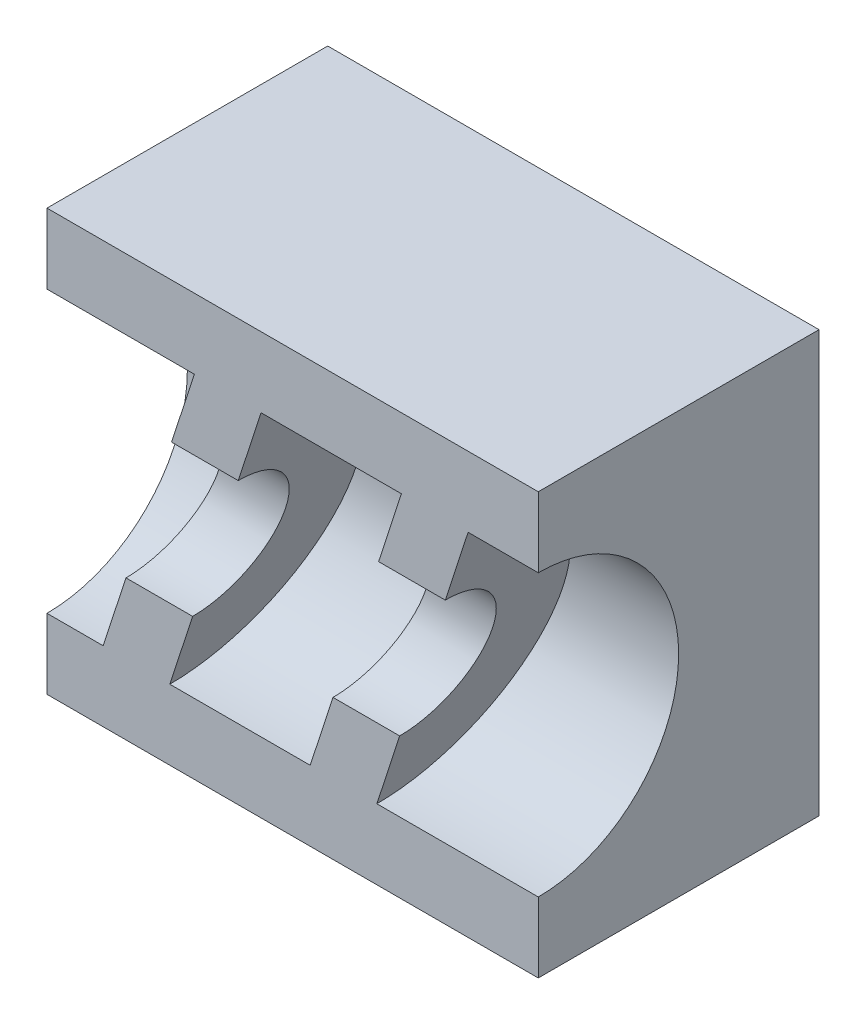
ISO-10303-21;
HEADER;
FILE_DESCRIPTION(('STEP AP214'),'2;1');
FILE_NAME('part.step','',(''),(''),'','','');
FILE_SCHEMA(('AUTOMOTIVE_DESIGN { 1 0 10303 214 1 1 1 1 }'));
ENDSEC;
DATA;
#1=APPLICATION_CONTEXT('core data for automotive mechanical design processes');
#2=APPLICATION_PROTOCOL_DEFINITION('international standard','automotive_design',2000,#1);
#3=PRODUCT_CONTEXT('',#1,'mechanical');
#4=PRODUCT('Part','Part','',(#3));
#5=PRODUCT_RELATED_PRODUCT_CATEGORY('part','',(#4));
#6=PRODUCT_DEFINITION_FORMATION('','',#4);
#7=PRODUCT_DEFINITION_CONTEXT('part definition',#1,'design');
#8=PRODUCT_DEFINITION('design','',#6,#7);
#9=PRODUCT_DEFINITION_SHAPE('','',#8);
#10=(LENGTH_UNIT() NAMED_UNIT(*) SI_UNIT(.MILLI.,.METRE.));
#11=(NAMED_UNIT(*) PLANE_ANGLE_UNIT() SI_UNIT($,.RADIAN.));
#12=(NAMED_UNIT(*) SI_UNIT($,.STERADIAN.) SOLID_ANGLE_UNIT());
#13=UNCERTAINTY_MEASURE_WITH_UNIT(LENGTH_MEASURE(1.E-05),#10,'distance_accuracy_value','');
#14=(GEOMETRIC_REPRESENTATION_CONTEXT(3) GLOBAL_UNCERTAINTY_ASSIGNED_CONTEXT((#13)) GLOBAL_UNIT_ASSIGNED_CONTEXT((#10,
#11,#12)) REPRESENTATION_CONTEXT('',''));
#15=CARTESIAN_POINT('',(0.,0.,0.));
#16=DIRECTION('',(0.,0.,1.));
#17=DIRECTION('',(1.,0.,0.));
#18=AXIS2_PLACEMENT_3D('',#15,#16,#17);
#19=CARTESIAN_POINT('',(0.,0.,4.));
#20=DIRECTION('',(0.,0.,-1.));
#21=DIRECTION('',(-1.,0.,0.));
#22=AXIS2_PLACEMENT_3D('',#19,#20,#21);
#23=PLANE('',#22);
#24=DIRECTION('',(-0.309016994374951,-0.951056516295152,0.));
#25=VECTOR('',#24,1.);
#26=CARTESIAN_POINT('',(2.1,5.,4.));
#27=LINE('',#26,#25);
#28=CARTESIAN_POINT('',(2.1,5.,4.));
#29=VERTEX_POINT('',#28);
#30=CARTESIAN_POINT('',(1.77508030376709,4.,4.));
#31=VERTEX_POINT('',#30);
#32=EDGE_CURVE('E145',#29,#31,#27,.T.);
#33=ORIENTED_EDGE('',*,*,#32,.T.);
#34=DIRECTION('',(1.,0.,0.));
#35=VECTOR('',#34,1.);
#36=CARTESIAN_POINT('',(0.,4.,4.));
#37=LINE('',#36,#35);
#38=CARTESIAN_POINT('',(2.72508030376709,4.,4.));
#39=VERTEX_POINT('',#38);
#40=EDGE_CURVE('E135',#31,#39,#37,.T.);
#41=ORIENTED_EDGE('',*,*,#40,.T.);
#42=DIRECTION('',(0.309016994374951,0.951056516295152,0.));
#43=VECTOR('',#42,1.);
#44=CARTESIAN_POINT('',(3.05,5.,4.));
#45=LINE('',#44,#43);
#46=CARTESIAN_POINT('',(3.05,5.,4.));
#47=VERTEX_POINT('',#46);
#48=EDGE_CURVE('E142',#39,#47,#45,.T.);
#49=ORIENTED_EDGE('',*,*,#48,.T.);
#50=DIRECTION('',(-1.,0.,0.));
#51=VECTOR('',#50,1.);
#52=CARTESIAN_POINT('',(7.,5.,4.));
#53=LINE('',#52,#51);
#54=CARTESIAN_POINT('',(5.05,5.,4.));
#55=VERTEX_POINT('',#54);
#56=EDGE_CURVE('E214',#47,#55,#53,.F.);
#57=ORIENTED_EDGE('',*,*,#56,.T.);
#58=DIRECTION('',(-0.309016994374951,-0.951056516295152,0.));
#59=VECTOR('',#58,1.);
#60=CARTESIAN_POINT('',(5.05,5.,4.));
#61=LINE('',#60,#59);
#62=CARTESIAN_POINT('',(4.72508030376709,4.,4.));
#63=VERTEX_POINT('',#62);
#64=EDGE_CURVE('E164',#55,#63,#61,.T.);
#65=ORIENTED_EDGE('',*,*,#64,.T.);
#66=CARTESIAN_POINT('',(5.67508030376709,4.,4.));
#67=VERTEX_POINT('',#66);
#68=EDGE_CURVE('E148',#63,#67,#37,.T.);
#69=ORIENTED_EDGE('',*,*,#68,.T.);
#70=DIRECTION('',(0.309016994374951,0.951056516295152,0.));
#71=VECTOR('',#70,1.);
#72=CARTESIAN_POINT('',(6.,5.,4.));
#73=LINE('',#72,#71);
#74=CARTESIAN_POINT('',(6.,5.,4.));
#75=VERTEX_POINT('',#74);
#76=EDGE_CURVE('E167',#67,#75,#73,.T.);
#77=ORIENTED_EDGE('',*,*,#76,.T.);
#78=CARTESIAN_POINT('',(7.,5.,4.));
#79=VERTEX_POINT('',#78);
#80=EDGE_CURVE('E210',#75,#79,#53,.F.);
#81=ORIENTED_EDGE('',*,*,#80,.T.);
#82=DIRECTION('',(0.,1.,0.));
#83=VECTOR('',#82,1.);
#84=CARTESIAN_POINT('',(7.,0.,4.));
#85=LINE('',#84,#83);
#86=CARTESIAN_POINT('',(7.,6.,4.));
#87=VERTEX_POINT('',#86);
#88=EDGE_CURVE('E184',#79,#87,#85,.T.);
#89=ORIENTED_EDGE('',*,*,#88,.T.);
#90=DIRECTION('',(-1.,0.,0.));
#91=VECTOR('',#90,1.);
#92=CARTESIAN_POINT('',(0.,6.,4.));
#93=LINE('',#92,#91);
#94=CARTESIAN_POINT('',(0.,6.,4.));
#95=VERTEX_POINT('',#94);
#96=EDGE_CURVE('E188',#87,#95,#93,.T.);
#97=ORIENTED_EDGE('',*,*,#96,.T.);
#98=DIRECTION('',(0.,-1.,0.));
#99=VECTOR('',#98,1.);
#100=CARTESIAN_POINT('',(0.,0.,4.));
#101=LINE('',#100,#99);
#102=CARTESIAN_POINT('',(0.,5.,4.));
#103=VERTEX_POINT('',#102);
#104=EDGE_CURVE('E178',#95,#103,#101,.T.);
#105=ORIENTED_EDGE('',*,*,#104,.T.);
#106=EDGE_CURVE('E211',#103,#29,#53,.F.);
#107=ORIENTED_EDGE('',*,*,#106,.T.);
#108=EDGE_LOOP('',(#33,#41,#49,#57,#65,#69,#77,#81,#89,#97,#105,#107));
#109=FACE_BOUND('',#108,.T.);
#110=ADVANCED_FACE('F36',(#109),#23,.F.);
#111=CARTESIAN_POINT('',(7.,3.,4.));
#112=DIRECTION('',(-1.,0.,0.));
#113=DIRECTION('',(0.,0.,1.));
#114=AXIS2_PLACEMENT_3D('',#111,#112,#113);
#115=CYLINDRICAL_SURFACE('',#114,2.);
#116=DIRECTION('',(-1.,0.,0.));
#117=VECTOR('',#116,1.);
#118=CARTESIAN_POINT('',(7.,1.,4.));
#119=LINE('',#118,#117);
#120=CARTESIAN_POINT('',(0.800321215068356,1.,4.));
#121=VERTEX_POINT('',#120);
#122=CARTESIAN_POINT('',(0.,1.,4.));
#123=VERTEX_POINT('',#122);
#124=EDGE_CURVE('E213',#121,#123,#119,.T.);
#125=ORIENTED_EDGE('',*,*,#124,.F.);
#126=CARTESIAN_POINT('',(1.45016060753418,3.,4.));
#127=DIRECTION('',(-0.951056516295152,0.309016994374951,0.));
#128=DIRECTION('',(-0.309016994374951,-0.951056516295152,0.));
#129=AXIS2_PLACEMENT_3D('',#126,#127,#128);
#130=ELLIPSE('',#129,2.10292444847654,2.);
#131=EDGE_CURVE('E160',#121,#29,#130,.F.);
#132=ORIENTED_EDGE('',*,*,#131,.T.);
#133=ORIENTED_EDGE('',*,*,#106,.F.);
#134=CARTESIAN_POINT('',(0.,3.,4.));
#135=DIRECTION('',(-1.,0.,0.));
#136=DIRECTION('',(0.,0.,1.));
#137=AXIS2_PLACEMENT_3D('',#134,#135,#136);
#138=CIRCLE('',#137,2.);
#139=EDGE_CURVE('E171',#103,#123,#138,.T.);
#140=ORIENTED_EDGE('',*,*,#139,.T.);
#141=EDGE_LOOP('',(#125,#132,#133,#140));
#142=FACE_BOUND('',#141,.T.);
#143=ADVANCED_FACE('F259',(#142),#115,.F.);
#144=ORIENTED_EDGE('',*,*,#56,.F.);
#145=CARTESIAN_POINT('',(2.40016060753418,3.,4.));
#146=DIRECTION('',(0.951056516295152,-0.309016994374951,0.));
#147=DIRECTION('',(-0.309016994374951,-0.951056516295152,0.));
#148=AXIS2_PLACEMENT_3D('',#145,#146,#147);
#149=ELLIPSE('',#148,2.10292444847654,2.);
#150=CARTESIAN_POINT('',(1.75032121506836,1.,4.));
#151=VERTEX_POINT('',#150);
#152=EDGE_CURVE('E151',#47,#151,#149,.F.);
#153=ORIENTED_EDGE('',*,*,#152,.T.);
#154=CARTESIAN_POINT('',(3.75032121506836,1.,4.));
#155=VERTEX_POINT('',#154);
#156=EDGE_CURVE('E219',#155,#151,#119,.T.);
#157=ORIENTED_EDGE('',*,*,#156,.F.);
#158=CARTESIAN_POINT('',(4.40016060753418,3.,4.));
#159=DIRECTION('',(-0.951056516295153,0.309016994374951,0.));
#160=DIRECTION('',(-0.309016994374951,-0.951056516295152,0.));
#161=AXIS2_PLACEMENT_3D('',#158,#159,#160);
#162=ELLIPSE('',#161,2.10292444847654,2.);
#163=EDGE_CURVE('E44',#155,#55,#162,.F.);
#164=ORIENTED_EDGE('',*,*,#163,.T.);
#165=EDGE_LOOP('',(#144,#153,#157,#164));
#166=FACE_BOUND('',#165,.T.);
#167=ADVANCED_FACE('F225',(#166),#115,.F.);
#168=CARTESIAN_POINT('',(0.,0.,4.));
#169=DIRECTION('',(1.,0.,0.));
#170=DIRECTION('',(0.,0.,-1.));
#171=AXIS2_PLACEMENT_3D('',#168,#169,#170);
#172=PLANE('',#171);
#173=CARTESIAN_POINT('',(0.,0.,4.));
#174=VERTEX_POINT('',#173);
#175=EDGE_CURVE('E182',#123,#174,#101,.T.);
#176=ORIENTED_EDGE('',*,*,#175,.F.);
#177=ORIENTED_EDGE('',*,*,#139,.F.);
#178=ORIENTED_EDGE('',*,*,#104,.F.);
#179=DIRECTION('',(0.,0.,-1.));
#180=VECTOR('',#179,1.);
#181=CARTESIAN_POINT('',(0.,6.,4.));
#182=LINE('',#181,#180);
#183=CARTESIAN_POINT('',(0.,6.,0.));
#184=VERTEX_POINT('',#183);
#185=EDGE_CURVE('E190',#95,#184,#182,.T.);
#186=ORIENTED_EDGE('',*,*,#185,.T.);
#187=DIRECTION('',(0.,-1.,0.));
#188=VECTOR('',#187,1.);
#189=CARTESIAN_POINT('',(0.,0.,0.));
#190=LINE('',#189,#188);
#191=CARTESIAN_POINT('',(0.,0.,0.));
#192=VERTEX_POINT('',#191);
#193=EDGE_CURVE('E175',#184,#192,#190,.T.);
#194=ORIENTED_EDGE('',*,*,#193,.T.);
#195=DIRECTION('',(0.,0.,-1.));
#196=VECTOR('',#195,1.);
#197=CARTESIAN_POINT('',(0.,0.,4.));
#198=LINE('',#197,#196);
#199=EDGE_CURVE('E207',#174,#192,#198,.T.);
#200=ORIENTED_EDGE('',*,*,#199,.F.);
#201=EDGE_LOOP('',(#176,#177,#178,#186,#194,#200));
#202=FACE_BOUND('',#201,.T.);
#203=ADVANCED_FACE('F38',(#202),#172,.F.);
#204=CARTESIAN_POINT('',(0.,0.,4.));
#205=DIRECTION('',(0.,1.,0.));
#206=DIRECTION('',(0.,0.,1.));
#207=AXIS2_PLACEMENT_3D('',#204,#205,#206);
#208=PLANE('',#207);
#209=DIRECTION('',(1.,0.,0.));
#210=VECTOR('',#209,1.);
#211=CARTESIAN_POINT('',(0.,0.,0.));
#212=LINE('',#211,#210);
#213=CARTESIAN_POINT('',(7.,0.,0.));
#214=VERTEX_POINT('',#213);
#215=EDGE_CURVE('E193',#192,#214,#212,.T.);
#216=ORIENTED_EDGE('',*,*,#215,.T.);
#217=DIRECTION('',(0.,0.,-1.));
#218=VECTOR('',#217,1.);
#219=CARTESIAN_POINT('',(7.,0.,4.));
#220=LINE('',#219,#218);
#221=CARTESIAN_POINT('',(7.,0.,4.));
#222=VERTEX_POINT('',#221);
#223=EDGE_CURVE('E204',#222,#214,#220,.T.);
#224=ORIENTED_EDGE('',*,*,#223,.F.);
#225=DIRECTION('',(1.,0.,0.));
#226=VECTOR('',#225,1.);
#227=CARTESIAN_POINT('',(0.,0.,4.));
#228=LINE('',#227,#226);
#229=EDGE_CURVE('E181',#174,#222,#228,.T.);
#230=ORIENTED_EDGE('',*,*,#229,.F.);
#231=ORIENTED_EDGE('',*,*,#199,.T.);
#232=EDGE_LOOP('',(#216,#224,#230,#231));
#233=FACE_BOUND('',#232,.T.);
#234=ADVANCED_FACE('F273',(#233),#208,.F.);
#235=CARTESIAN_POINT('',(7.,0.,4.));
#236=DIRECTION('',(-1.,0.,0.));
#237=DIRECTION('',(0.,0.,1.));
#238=AXIS2_PLACEMENT_3D('',#235,#236,#237);
#239=PLANE('',#238);
#240=ORIENTED_EDGE('',*,*,#88,.F.);
#241=CARTESIAN_POINT('',(7.,3.,4.));
#242=DIRECTION('',(-1.,0.,0.));
#243=DIRECTION('',(0.,0.,1.));
#244=AXIS2_PLACEMENT_3D('',#241,#242,#243);
#245=CIRCLE('',#244,2.);
#246=CARTESIAN_POINT('',(7.,1.,4.));
#247=VERTEX_POINT('',#246);
#248=EDGE_CURVE('E172',#79,#247,#245,.T.);
#249=ORIENTED_EDGE('',*,*,#248,.T.);
#250=EDGE_CURVE('E185',#222,#247,#85,.T.);
#251=ORIENTED_EDGE('',*,*,#250,.F.);
#252=ORIENTED_EDGE('',*,*,#223,.T.);
#253=DIRECTION('',(0.,1.,0.));
#254=VECTOR('',#253,1.);
#255=CARTESIAN_POINT('',(7.,0.,0.));
#256=LINE('',#255,#254);
#257=CARTESIAN_POINT('',(7.,6.,0.));
#258=VERTEX_POINT('',#257);
#259=EDGE_CURVE('E195',#214,#258,#256,.T.);
#260=ORIENTED_EDGE('',*,*,#259,.T.);
#261=DIRECTION('',(0.,0.,-1.));
#262=VECTOR('',#261,1.);
#263=CARTESIAN_POINT('',(7.,6.,4.));
#264=LINE('',#263,#262);
#265=EDGE_CURVE('E201',#87,#258,#264,.T.);
#266=ORIENTED_EDGE('',*,*,#265,.F.);
#267=EDGE_LOOP('',(#240,#249,#251,#252,#260,#266));
#268=FACE_BOUND('',#267,.T.);
#269=ADVANCED_FACE('F244',(#268),#239,.F.);
#270=CARTESIAN_POINT('',(0.,6.,4.));
#271=DIRECTION('',(0.,-1.,0.));
#272=DIRECTION('',(0.,0.,-1.));
#273=AXIS2_PLACEMENT_3D('',#270,#271,#272);
#274=PLANE('',#273);
#275=DIRECTION('',(-1.,0.,0.));
#276=VECTOR('',#275,1.);
#277=CARTESIAN_POINT('',(0.,6.,0.));
#278=LINE('',#277,#276);
#279=EDGE_CURVE('E197',#258,#184,#278,.T.);
#280=ORIENTED_EDGE('',*,*,#279,.T.);
#281=ORIENTED_EDGE('',*,*,#185,.F.);
#282=ORIENTED_EDGE('',*,*,#96,.F.);
#283=ORIENTED_EDGE('',*,*,#265,.T.);
#284=EDGE_LOOP('',(#280,#281,#282,#283));
#285=FACE_BOUND('',#284,.T.);
#286=ADVANCED_FACE('F250',(#285),#274,.F.);
#287=CARTESIAN_POINT('',(4.70032121506836,1.,4.));
#288=VERTEX_POINT('',#287);
#289=CARTESIAN_POINT('',(5.02524091130127,2.,4.));
#290=VERTEX_POINT('',#289);
#291=EDGE_CURVE('E168',#288,#290,#73,.T.);
#292=ORIENTED_EDGE('',*,*,#291,.T.);
#293=DIRECTION('',(1.,0.,0.));
#294=VECTOR('',#293,1.);
#295=CARTESIAN_POINT('',(0.,2.,4.));
#296=LINE('',#295,#294);
#297=CARTESIAN_POINT('',(4.07524091130127,2.,4.));
#298=VERTEX_POINT('',#297);
#299=EDGE_CURVE('E51',#290,#298,#296,.F.);
#300=ORIENTED_EDGE('',*,*,#299,.T.);
#301=EDGE_CURVE('E163',#298,#155,#61,.T.);
#302=ORIENTED_EDGE('',*,*,#301,.T.);
#303=ORIENTED_EDGE('',*,*,#156,.T.);
#304=CARTESIAN_POINT('',(2.07524091130127,2.,4.));
#305=VERTEX_POINT('',#304);
#306=EDGE_CURVE('E153',#151,#305,#45,.T.);
#307=ORIENTED_EDGE('',*,*,#306,.T.);
#308=CARTESIAN_POINT('',(1.12524091130127,2.,4.));
#309=VERTEX_POINT('',#308);
#310=EDGE_CURVE('E58',#305,#309,#296,.F.);
#311=ORIENTED_EDGE('',*,*,#310,.T.);
#312=EDGE_CURVE('E155',#309,#121,#27,.T.);
#313=ORIENTED_EDGE('',*,*,#312,.T.);
#314=ORIENTED_EDGE('',*,*,#124,.T.);
#315=ORIENTED_EDGE('',*,*,#175,.T.);
#316=ORIENTED_EDGE('',*,*,#229,.T.);
#317=ORIENTED_EDGE('',*,*,#250,.T.);
#318=EDGE_CURVE('E215',#247,#288,#119,.T.);
#319=ORIENTED_EDGE('',*,*,#318,.T.);
#320=EDGE_LOOP('',(#292,#300,#302,#303,#307,#311,#313,#314,#315,#316,#317,#319));
#321=FACE_BOUND('',#320,.T.);
#322=ADVANCED_FACE('F269',(#321),#23,.F.);
#323=CARTESIAN_POINT('',(0.,0.,0.));
#324=DIRECTION('',(0.,0.,-1.));
#325=DIRECTION('',(-1.,0.,0.));
#326=AXIS2_PLACEMENT_3D('',#323,#324,#325);
#327=PLANE('',#326);
#328=ORIENTED_EDGE('',*,*,#193,.F.);
#329=ORIENTED_EDGE('',*,*,#279,.F.);
#330=ORIENTED_EDGE('',*,*,#259,.F.);
#331=ORIENTED_EDGE('',*,*,#215,.F.);
#332=EDGE_LOOP('',(#328,#329,#330,#331));
#333=FACE_BOUND('',#332,.T.);
#334=ADVANCED_FACE('F275',(#333),#327,.T.);
#335=ORIENTED_EDGE('',*,*,#80,.F.);
#336=CARTESIAN_POINT('',(5.35016060753418,3.,4.));
#337=DIRECTION('',(0.951056516295152,-0.309016994374951,0.));
#338=DIRECTION('',(-0.309016994374951,-0.951056516295152,0.));
#339=AXIS2_PLACEMENT_3D('',#336,#337,#338);
#340=ELLIPSE('',#339,2.10292444847654,2.);
#341=EDGE_CURVE('E218',#75,#288,#340,.F.);
#342=ORIENTED_EDGE('',*,*,#341,.T.);
#343=ORIENTED_EDGE('',*,*,#318,.F.);
#344=ORIENTED_EDGE('',*,*,#248,.F.);
#345=EDGE_LOOP('',(#335,#342,#343,#344));
#346=FACE_BOUND('',#345,.T.);
#347=ADVANCED_FACE('F241',(#346),#115,.F.);
#348=CARTESIAN_POINT('',(5.05,5.,0.));
#349=DIRECTION('',(-0.951056516295153,0.309016994374951,0.));
#350=DIRECTION('',(-0.309016994374951,-0.951056516295152,0.));
#351=AXIS2_PLACEMENT_3D('',#348,#349,#350);
#352=PLANE('',#351);
#353=CARTESIAN_POINT('',(4.40016060753418,3.,4.));
#354=DIRECTION('',(-0.951056516295153,0.309016994374951,0.));
#355=DIRECTION('',(0.309016994374951,0.951056516295152,0.));
#356=AXIS2_PLACEMENT_3D('',#353,#354,#355);
#357=ELLIPSE('',#356,1.05146222423827,1.);
#358=EDGE_CURVE('E232',#63,#298,#357,.T.);
#359=ORIENTED_EDGE('',*,*,#358,.F.);
#360=ORIENTED_EDGE('',*,*,#64,.F.);
#361=ORIENTED_EDGE('',*,*,#163,.F.);
#362=ORIENTED_EDGE('',*,*,#301,.F.);
#363=EDGE_LOOP('',(#359,#360,#361,#362));
#364=FACE_BOUND('',#363,.T.);
#365=ADVANCED_FACE('F231',(#364),#352,.T.);
#366=CARTESIAN_POINT('',(6.,5.,0.));
#367=DIRECTION('',(0.951056516295152,-0.309016994374951,0.));
#368=DIRECTION('',(0.309016994374951,0.951056516295152,0.));
#369=AXIS2_PLACEMENT_3D('',#366,#367,#368);
#370=PLANE('',#369);
#371=CARTESIAN_POINT('',(5.35016060753418,3.,4.));
#372=DIRECTION('',(0.951056516295152,-0.309016994374951,0.));
#373=DIRECTION('',(0.309016994374951,0.951056516295152,0.));
#374=AXIS2_PLACEMENT_3D('',#371,#372,#373);
#375=ELLIPSE('',#374,1.05146222423827,1.);
#376=EDGE_CURVE('E264',#290,#67,#375,.T.);
#377=ORIENTED_EDGE('',*,*,#376,.F.);
#378=ORIENTED_EDGE('',*,*,#291,.F.);
#379=ORIENTED_EDGE('',*,*,#341,.F.);
#380=ORIENTED_EDGE('',*,*,#76,.F.);
#381=EDGE_LOOP('',(#377,#378,#379,#380));
#382=FACE_BOUND('',#381,.T.);
#383=ADVANCED_FACE('F277',(#382),#370,.T.);
#384=CARTESIAN_POINT('',(2.1,5.,0.));
#385=DIRECTION('',(-0.951056516295152,0.309016994374951,0.));
#386=DIRECTION('',(-0.309016994374951,-0.951056516295152,0.));
#387=AXIS2_PLACEMENT_3D('',#384,#385,#386);
#388=PLANE('',#387);
#389=CARTESIAN_POINT('',(1.45016060753418,3.,4.));
#390=DIRECTION('',(-0.951056516295152,0.309016994374951,0.));
#391=DIRECTION('',(0.309016994374951,0.951056516295152,0.));
#392=AXIS2_PLACEMENT_3D('',#389,#390,#391);
#393=ELLIPSE('',#392,1.05146222423827,1.);
#394=EDGE_CURVE('E146',#31,#309,#393,.T.);
#395=ORIENTED_EDGE('',*,*,#394,.F.);
#396=ORIENTED_EDGE('',*,*,#32,.F.);
#397=ORIENTED_EDGE('',*,*,#131,.F.);
#398=ORIENTED_EDGE('',*,*,#312,.F.);
#399=EDGE_LOOP('',(#395,#396,#397,#398));
#400=FACE_BOUND('',#399,.T.);
#401=ADVANCED_FACE('F263',(#400),#388,.T.);
#402=CARTESIAN_POINT('',(3.05,5.,0.));
#403=DIRECTION('',(0.951056516295152,-0.309016994374951,0.));
#404=DIRECTION('',(0.309016994374951,0.951056516295152,0.));
#405=AXIS2_PLACEMENT_3D('',#402,#403,#404);
#406=PLANE('',#405);
#407=CARTESIAN_POINT('',(2.40016060753418,3.,4.));
#408=DIRECTION('',(0.951056516295152,-0.309016994374951,0.));
#409=DIRECTION('',(0.309016994374951,0.951056516295152,0.));
#410=AXIS2_PLACEMENT_3D('',#407,#408,#409);
#411=ELLIPSE('',#410,1.05146222423827,1.);
#412=EDGE_CURVE('E11',#305,#39,#411,.T.);
#413=ORIENTED_EDGE('',*,*,#412,.F.);
#414=ORIENTED_EDGE('',*,*,#306,.F.);
#415=ORIENTED_EDGE('',*,*,#152,.F.);
#416=ORIENTED_EDGE('',*,*,#48,.F.);
#417=EDGE_LOOP('',(#413,#414,#415,#416));
#418=FACE_BOUND('',#417,.T.);
#419=ADVANCED_FACE('F149',(#418),#406,.T.);
#420=CARTESIAN_POINT('',(0.,3.,4.));
#421=DIRECTION('',(1.,0.,0.));
#422=DIRECTION('',(0.,0.,-1.));
#423=AXIS2_PLACEMENT_3D('',#420,#421,#422);
#424=CYLINDRICAL_SURFACE('',#423,1.);
#425=ORIENTED_EDGE('',*,*,#394,.T.);
#426=ORIENTED_EDGE('',*,*,#310,.F.);
#427=ORIENTED_EDGE('',*,*,#412,.T.);
#428=ORIENTED_EDGE('',*,*,#40,.F.);
#429=EDGE_LOOP('',(#425,#426,#427,#428));
#430=FACE_BOUND('',#429,.T.);
#431=ADVANCED_FACE('F134',(#430),#424,.F.);
#432=ORIENTED_EDGE('',*,*,#358,.T.);
#433=ORIENTED_EDGE('',*,*,#299,.F.);
#434=ORIENTED_EDGE('',*,*,#376,.T.);
#435=ORIENTED_EDGE('',*,*,#68,.F.);
#436=EDGE_LOOP('',(#432,#433,#434,#435));
#437=FACE_BOUND('',#436,.T.);
#438=ADVANCED_FACE('F278',(#437),#424,.F.);
#439=CLOSED_SHELL('',(#110,#143,#167,#203,#234,#269,#286,#322,#334,#347,#365,#383,#401,#419,
#431,#438));
#440=MANIFOLD_SOLID_BREP('B2',#439);
#441=ADVANCED_BREP_SHAPE_REPRESENTATION('',(#18,#440),#14);
#442=SHAPE_DEFINITION_REPRESENTATION(#9,#441);
ENDSEC;
END-ISO-10303-21;
